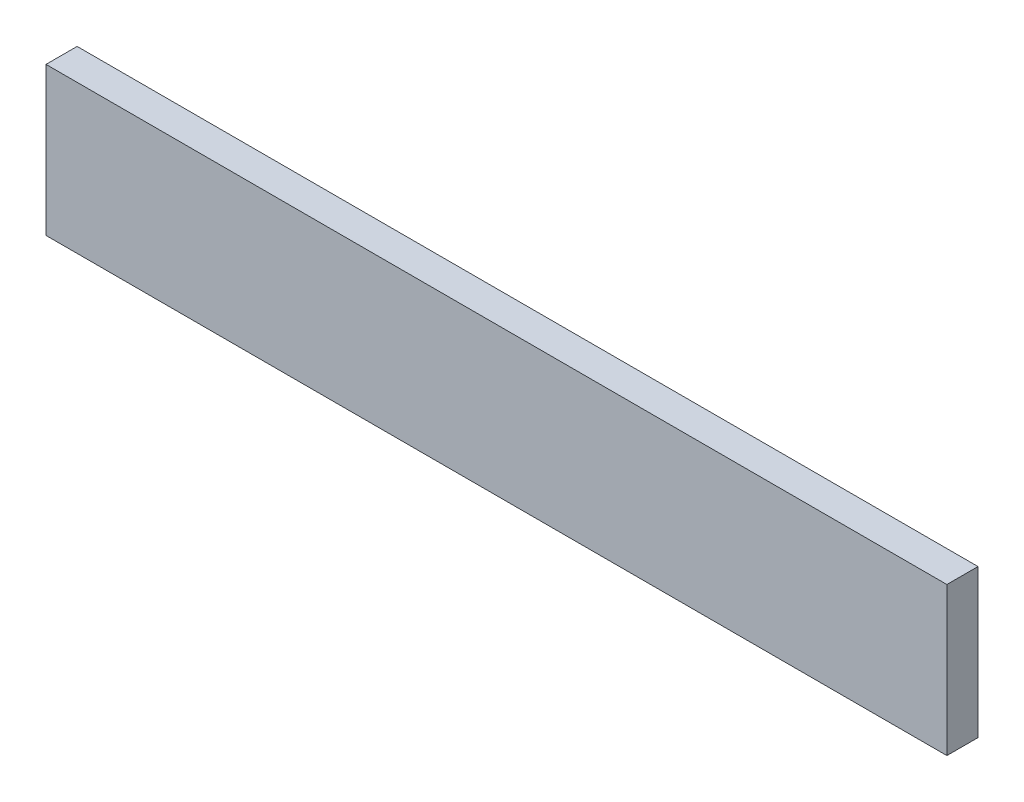
ISO-10303-21;
HEADER;
FILE_DESCRIPTION(('STEP AP214'),'2;1');
FILE_NAME('part.step','',(''),(''),'','','');
FILE_SCHEMA(('AUTOMOTIVE_DESIGN { 1 0 10303 214 1 1 1 1 }'));
ENDSEC;
DATA;
#1=APPLICATION_CONTEXT('core data for automotive mechanical design processes');
#2=APPLICATION_PROTOCOL_DEFINITION('international standard','automotive_design',2000,#1);
#3=PRODUCT_CONTEXT('',#1,'mechanical');
#4=PRODUCT('Part','Part','',(#3));
#5=PRODUCT_RELATED_PRODUCT_CATEGORY('part','',(#4));
#6=PRODUCT_DEFINITION_FORMATION('','',#4);
#7=PRODUCT_DEFINITION_CONTEXT('part definition',#1,'design');
#8=PRODUCT_DEFINITION('design','',#6,#7);
#9=PRODUCT_DEFINITION_SHAPE('','',#8);
#10=(LENGTH_UNIT() NAMED_UNIT(*) SI_UNIT(.MILLI.,.METRE.));
#11=(NAMED_UNIT(*) PLANE_ANGLE_UNIT() SI_UNIT($,.RADIAN.));
#12=(NAMED_UNIT(*) SI_UNIT($,.STERADIAN.) SOLID_ANGLE_UNIT());
#13=UNCERTAINTY_MEASURE_WITH_UNIT(LENGTH_MEASURE(1.E-05),#10,'distance_accuracy_value','');
#14=(GEOMETRIC_REPRESENTATION_CONTEXT(3) GLOBAL_UNCERTAINTY_ASSIGNED_CONTEXT((#13)) GLOBAL_UNIT_ASSIGNED_CONTEXT((#10,
#11,#12)) REPRESENTATION_CONTEXT('',''));
#15=CARTESIAN_POINT('',(0.,0.,0.));
#16=DIRECTION('',(0.,0.,1.));
#17=DIRECTION('',(1.,0.,0.));
#18=AXIS2_PLACEMENT_3D('',#15,#16,#17);
#19=CARTESIAN_POINT('',(0.,0.,2.667));
#20=DIRECTION('',(1.,0.,0.));
#21=DIRECTION('',(0.,0.,-1.));
#22=AXIS2_PLACEMENT_3D('',#19,#20,#21);
#23=PLANE('',#22);
#24=DIRECTION('',(0.,-1.,0.));
#25=VECTOR('',#24,1.);
#26=CARTESIAN_POINT('',(0.,0.,-2.667));
#27=LINE('',#26,#25);
#28=CARTESIAN_POINT('',(0.,25.4,-2.667));
#29=VERTEX_POINT('',#28);
#30=CARTESIAN_POINT('',(0.,0.,-2.667));
#31=VERTEX_POINT('',#30);
#32=EDGE_CURVE('E98',#29,#31,#27,.T.);
#33=ORIENTED_EDGE('',*,*,#32,.T.);
#34=DIRECTION('',(0.,0.,-1.));
#35=VECTOR('',#34,1.);
#36=CARTESIAN_POINT('',(0.,0.,2.667));
#37=LINE('',#36,#35);
#38=CARTESIAN_POINT('',(0.,0.,2.667));
#39=VERTEX_POINT('',#38);
#40=EDGE_CURVE('E11',#39,#31,#37,.T.);
#41=ORIENTED_EDGE('',*,*,#40,.F.);
#42=DIRECTION('',(0.,-1.,0.));
#43=VECTOR('',#42,1.);
#44=CARTESIAN_POINT('',(0.,0.,2.667));
#45=LINE('',#44,#43);
#46=CARTESIAN_POINT('',(0.,25.4,2.667));
#47=VERTEX_POINT('',#46);
#48=EDGE_CURVE('E86',#47,#39,#45,.T.);
#49=ORIENTED_EDGE('',*,*,#48,.F.);
#50=DIRECTION('',(0.,0.,-1.));
#51=VECTOR('',#50,1.);
#52=CARTESIAN_POINT('',(0.,25.4,2.667));
#53=LINE('',#52,#51);
#54=EDGE_CURVE('E94',#47,#29,#53,.T.);
#55=ORIENTED_EDGE('',*,*,#54,.T.);
#56=EDGE_LOOP('',(#33,#41,#49,#55));
#57=FACE_BOUND('',#56,.T.);
#58=ADVANCED_FACE('F35',(#57),#23,.F.);
#59=CARTESIAN_POINT('',(0.,0.,2.667));
#60=DIRECTION('',(0.,1.,0.));
#61=DIRECTION('',(0.,0.,1.));
#62=AXIS2_PLACEMENT_3D('',#59,#60,#61);
#63=PLANE('',#62);
#64=DIRECTION('',(1.,0.,0.));
#65=VECTOR('',#64,1.);
#66=CARTESIAN_POINT('',(0.,0.,-2.667));
#67=LINE('',#66,#65);
#68=CARTESIAN_POINT('',(154.432,0.,-2.667));
#69=VERTEX_POINT('',#68);
#70=EDGE_CURVE('E90',#31,#69,#67,.T.);
#71=ORIENTED_EDGE('',*,*,#70,.T.);
#72=DIRECTION('',(0.,0.,-1.));
#73=VECTOR('',#72,1.);
#74=CARTESIAN_POINT('',(154.432,0.,2.667));
#75=LINE('',#74,#73);
#76=CARTESIAN_POINT('',(154.432,0.,2.667));
#77=VERTEX_POINT('',#76);
#78=EDGE_CURVE('E43',#77,#69,#75,.T.);
#79=ORIENTED_EDGE('',*,*,#78,.F.);
#80=DIRECTION('',(1.,0.,0.));
#81=VECTOR('',#80,1.);
#82=CARTESIAN_POINT('',(0.,0.,2.667));
#83=LINE('',#82,#81);
#84=EDGE_CURVE('E81',#39,#77,#83,.T.);
#85=ORIENTED_EDGE('',*,*,#84,.F.);
#86=ORIENTED_EDGE('',*,*,#40,.T.);
#87=EDGE_LOOP('',(#71,#79,#85,#86));
#88=FACE_BOUND('',#87,.T.);
#89=ADVANCED_FACE('F89',(#88),#63,.F.);
#90=CARTESIAN_POINT('',(154.432,0.,2.667));
#91=DIRECTION('',(-1.,0.,0.));
#92=DIRECTION('',(0.,0.,1.));
#93=AXIS2_PLACEMENT_3D('',#90,#91,#92);
#94=PLANE('',#93);
#95=DIRECTION('',(0.,1.,0.));
#96=VECTOR('',#95,1.);
#97=CARTESIAN_POINT('',(154.432,0.,-2.667));
#98=LINE('',#97,#96);
#99=CARTESIAN_POINT('',(154.432,25.4,-2.667));
#100=VERTEX_POINT('',#99);
#101=EDGE_CURVE('E68',#69,#100,#98,.T.);
#102=ORIENTED_EDGE('',*,*,#101,.T.);
#103=DIRECTION('',(0.,0.,-1.));
#104=VECTOR('',#103,1.);
#105=CARTESIAN_POINT('',(154.432,25.4,2.667));
#106=LINE('',#105,#104);
#107=CARTESIAN_POINT('',(154.432,25.4,2.667));
#108=VERTEX_POINT('',#107);
#109=EDGE_CURVE('E91',#108,#100,#106,.T.);
#110=ORIENTED_EDGE('',*,*,#109,.F.);
#111=DIRECTION('',(0.,1.,0.));
#112=VECTOR('',#111,1.);
#113=CARTESIAN_POINT('',(154.432,0.,2.667));
#114=LINE('',#113,#112);
#115=EDGE_CURVE('E84',#77,#108,#114,.T.);
#116=ORIENTED_EDGE('',*,*,#115,.F.);
#117=ORIENTED_EDGE('',*,*,#78,.T.);
#118=EDGE_LOOP('',(#102,#110,#116,#117));
#119=FACE_BOUND('',#118,.T.);
#120=ADVANCED_FACE('F92',(#119),#94,.F.);
#121=CARTESIAN_POINT('',(0.,25.4,2.667));
#122=DIRECTION('',(0.,-1.,0.));
#123=DIRECTION('',(0.,0.,-1.));
#124=AXIS2_PLACEMENT_3D('',#121,#122,#123);
#125=PLANE('',#124);
#126=DIRECTION('',(-1.,0.,0.));
#127=VECTOR('',#126,1.);
#128=CARTESIAN_POINT('',(0.,25.4,-2.667));
#129=LINE('',#128,#127);
#130=EDGE_CURVE('E74',#100,#29,#129,.T.);
#131=ORIENTED_EDGE('',*,*,#130,.T.);
#132=ORIENTED_EDGE('',*,*,#54,.F.);
#133=DIRECTION('',(-1.,0.,0.));
#134=VECTOR('',#133,1.);
#135=CARTESIAN_POINT('',(0.,25.4,2.667));
#136=LINE('',#135,#134);
#137=EDGE_CURVE('E51',#108,#47,#136,.T.);
#138=ORIENTED_EDGE('',*,*,#137,.F.);
#139=ORIENTED_EDGE('',*,*,#109,.T.);
#140=EDGE_LOOP('',(#131,#132,#138,#139));
#141=FACE_BOUND('',#140,.T.);
#142=ADVANCED_FACE('F105',(#141),#125,.F.);
#143=CARTESIAN_POINT('',(0.,25.4,2.667));
#144=DIRECTION('',(0.,0.,-1.));
#145=DIRECTION('',(-1.,0.,0.));
#146=AXIS2_PLACEMENT_3D('',#143,#144,#145);
#147=PLANE('',#146);
#148=ORIENTED_EDGE('',*,*,#48,.T.);
#149=ORIENTED_EDGE('',*,*,#84,.T.);
#150=ORIENTED_EDGE('',*,*,#115,.T.);
#151=ORIENTED_EDGE('',*,*,#137,.T.);
#152=EDGE_LOOP('',(#148,#149,#150,#151));
#153=FACE_BOUND('',#152,.T.);
#154=ADVANCED_FACE('F82',(#153),#147,.F.);
#155=CARTESIAN_POINT('',(0.,25.4,-2.667));
#156=DIRECTION('',(0.,0.,-1.));
#157=DIRECTION('',(-1.,0.,0.));
#158=AXIS2_PLACEMENT_3D('',#155,#156,#157);
#159=PLANE('',#158);
#160=ORIENTED_EDGE('',*,*,#32,.F.);
#161=ORIENTED_EDGE('',*,*,#130,.F.);
#162=ORIENTED_EDGE('',*,*,#101,.F.);
#163=ORIENTED_EDGE('',*,*,#70,.F.);
#164=EDGE_LOOP('',(#160,#161,#162,#163));
#165=FACE_BOUND('',#164,.T.);
#166=ADVANCED_FACE('F108',(#165),#159,.T.);
#167=CLOSED_SHELL('',(#58,#89,#120,#142,#154,#166));
#168=MANIFOLD_SOLID_BREP('B2',#167);
#169=ADVANCED_BREP_SHAPE_REPRESENTATION('',(#18,#168),#14);
#170=SHAPE_DEFINITION_REPRESENTATION(#9,#169);
ENDSEC;
END-ISO-10303-21;
